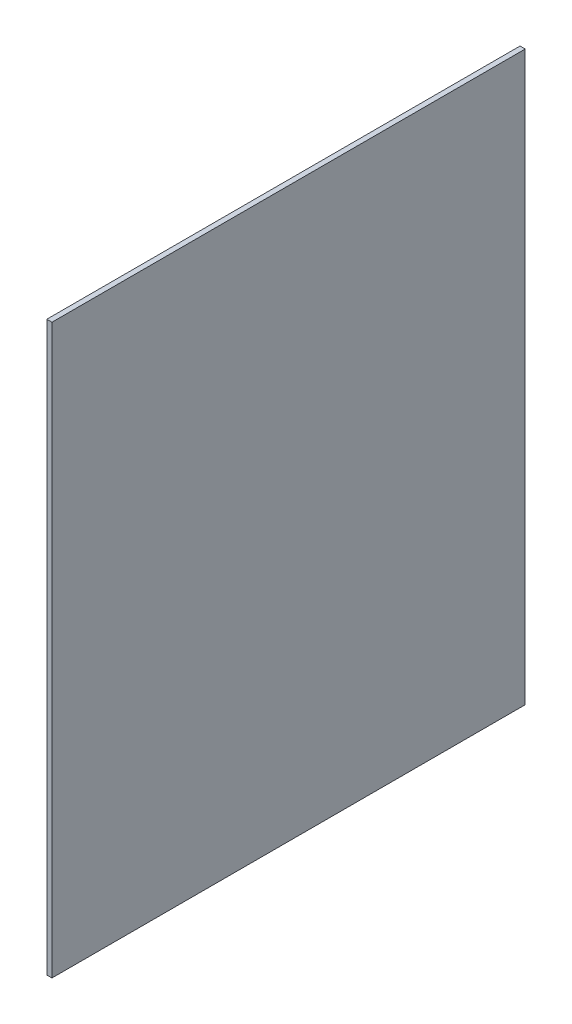
ISO-10303-21;
HEADER;
FILE_DESCRIPTION(('STEP AP214'),'2;1');
FILE_NAME('part.step','',(''),(''),'','','');
FILE_SCHEMA(('AUTOMOTIVE_DESIGN { 1 0 10303 214 1 1 1 1 }'));
ENDSEC;
DATA;
#1=APPLICATION_CONTEXT('core data for automotive mechanical design processes');
#2=APPLICATION_PROTOCOL_DEFINITION('international standard','automotive_design',2000,#1);
#3=PRODUCT_CONTEXT('',#1,'mechanical');
#4=PRODUCT('Part','Part','',(#3));
#5=PRODUCT_RELATED_PRODUCT_CATEGORY('part','',(#4));
#6=PRODUCT_DEFINITION_FORMATION('','',#4);
#7=PRODUCT_DEFINITION_CONTEXT('part definition',#1,'design');
#8=PRODUCT_DEFINITION('design','',#6,#7);
#9=PRODUCT_DEFINITION_SHAPE('','',#8);
#10=(LENGTH_UNIT() NAMED_UNIT(*) SI_UNIT(.MILLI.,.METRE.));
#11=(NAMED_UNIT(*) PLANE_ANGLE_UNIT() SI_UNIT($,.RADIAN.));
#12=(NAMED_UNIT(*) SI_UNIT($,.STERADIAN.) SOLID_ANGLE_UNIT());
#13=UNCERTAINTY_MEASURE_WITH_UNIT(LENGTH_MEASURE(1.E-05),#10,'distance_accuracy_value','');
#14=(GEOMETRIC_REPRESENTATION_CONTEXT(3) GLOBAL_UNCERTAINTY_ASSIGNED_CONTEXT((#13)) GLOBAL_UNIT_ASSIGNED_CONTEXT((#10,
#11,#12)) REPRESENTATION_CONTEXT('',''));
#15=CARTESIAN_POINT('',(0.,0.,0.));
#16=DIRECTION('',(0.,0.,1.));
#17=DIRECTION('',(1.,0.,0.));
#18=AXIS2_PLACEMENT_3D('',#15,#16,#17);
#19=CARTESIAN_POINT('',(3.,0.,0.));
#20=DIRECTION('',(0.,0.,-1.));
#21=DIRECTION('',(-1.,0.,0.));
#22=AXIS2_PLACEMENT_3D('',#19,#20,#21);
#23=PLANE('',#22);
#24=DIRECTION('',(0.,-1.,0.));
#25=VECTOR('',#24,1.);
#26=CARTESIAN_POINT('',(0.,0.,0.));
#27=LINE('',#26,#25);
#28=CARTESIAN_POINT('',(0.,330.,0.));
#29=VERTEX_POINT('',#28);
#30=CARTESIAN_POINT('',(0.,0.,0.));
#31=VERTEX_POINT('',#30);
#32=EDGE_CURVE('E107',#29,#31,#27,.T.);
#33=ORIENTED_EDGE('',*,*,#32,.T.);
#34=DIRECTION('',(-1.,0.,0.));
#35=VECTOR('',#34,1.);
#36=CARTESIAN_POINT('',(3.,0.,0.));
#37=LINE('',#36,#35);
#38=CARTESIAN_POINT('',(3.,0.,0.));
#39=VERTEX_POINT('',#38);
#40=EDGE_CURVE('E11',#39,#31,#37,.T.);
#41=ORIENTED_EDGE('',*,*,#40,.F.);
#42=DIRECTION('',(0.,-1.,0.));
#43=VECTOR('',#42,1.);
#44=CARTESIAN_POINT('',(3.,0.,0.));
#45=LINE('',#44,#43);
#46=CARTESIAN_POINT('',(3.,330.,0.));
#47=VERTEX_POINT('',#46);
#48=EDGE_CURVE('E91',#47,#39,#45,.T.);
#49=ORIENTED_EDGE('',*,*,#48,.F.);
#50=DIRECTION('',(-1.,0.,0.));
#51=VECTOR('',#50,1.);
#52=CARTESIAN_POINT('',(3.,330.,0.));
#53=LINE('',#52,#51);
#54=EDGE_CURVE('E103',#47,#29,#53,.T.);
#55=ORIENTED_EDGE('',*,*,#54,.T.);
#56=EDGE_LOOP('',(#33,#41,#49,#55));
#57=FACE_BOUND('',#56,.T.);
#58=ADVANCED_FACE('F39',(#57),#23,.F.);
#59=CARTESIAN_POINT('',(3.,0.,0.));
#60=DIRECTION('',(0.,1.,0.));
#61=DIRECTION('',(0.,0.,1.));
#62=AXIS2_PLACEMENT_3D('',#59,#60,#61);
#63=PLANE('',#62);
#64=DIRECTION('',(0.,0.,-1.));
#65=VECTOR('',#64,1.);
#66=CARTESIAN_POINT('',(0.,0.,0.));
#67=LINE('',#66,#65);
#68=CARTESIAN_POINT('',(0.,0.,-275.));
#69=VERTEX_POINT('',#68);
#70=EDGE_CURVE('E96',#31,#69,#67,.T.);
#71=ORIENTED_EDGE('',*,*,#70,.T.);
#72=DIRECTION('',(-1.,0.,0.));
#73=VECTOR('',#72,1.);
#74=CARTESIAN_POINT('',(3.,0.,-275.));
#75=LINE('',#74,#73);
#76=CARTESIAN_POINT('',(3.,0.,-275.));
#77=VERTEX_POINT('',#76);
#78=EDGE_CURVE('E48',#77,#69,#75,.T.);
#79=ORIENTED_EDGE('',*,*,#78,.F.);
#80=DIRECTION('',(0.,0.,-1.));
#81=VECTOR('',#80,1.);
#82=CARTESIAN_POINT('',(3.,0.,0.));
#83=LINE('',#82,#81);
#84=EDGE_CURVE('E86',#39,#77,#83,.T.);
#85=ORIENTED_EDGE('',*,*,#84,.F.);
#86=ORIENTED_EDGE('',*,*,#40,.T.);
#87=EDGE_LOOP('',(#71,#79,#85,#86));
#88=FACE_BOUND('',#87,.T.);
#89=ADVANCED_FACE('F95',(#88),#63,.F.);
#90=CARTESIAN_POINT('',(3.,0.,-275.));
#91=DIRECTION('',(0.,0.,1.));
#92=DIRECTION('',(1.,0.,0.));
#93=AXIS2_PLACEMENT_3D('',#90,#91,#92);
#94=PLANE('',#93);
#95=DIRECTION('',(0.,1.,0.));
#96=VECTOR('',#95,1.);
#97=CARTESIAN_POINT('',(0.,0.,-275.));
#98=LINE('',#97,#96);
#99=CARTESIAN_POINT('',(0.,330.,-275.));
#100=VERTEX_POINT('',#99);
#101=EDGE_CURVE('E73',#69,#100,#98,.T.);
#102=ORIENTED_EDGE('',*,*,#101,.T.);
#103=DIRECTION('',(-1.,0.,0.));
#104=VECTOR('',#103,1.);
#105=CARTESIAN_POINT('',(3.,330.,-275.));
#106=LINE('',#105,#104);
#107=CARTESIAN_POINT('',(3.,330.,-275.));
#108=VERTEX_POINT('',#107);
#109=EDGE_CURVE('E98',#108,#100,#106,.T.);
#110=ORIENTED_EDGE('',*,*,#109,.F.);
#111=DIRECTION('',(0.,1.,0.));
#112=VECTOR('',#111,1.);
#113=CARTESIAN_POINT('',(3.,0.,-275.));
#114=LINE('',#113,#112);
#115=EDGE_CURVE('E89',#77,#108,#114,.T.);
#116=ORIENTED_EDGE('',*,*,#115,.F.);
#117=ORIENTED_EDGE('',*,*,#78,.T.);
#118=EDGE_LOOP('',(#102,#110,#116,#117));
#119=FACE_BOUND('',#118,.T.);
#120=ADVANCED_FACE('F99',(#119),#94,.F.);
#121=CARTESIAN_POINT('',(3.,330.,0.));
#122=DIRECTION('',(0.,-1.,0.));
#123=DIRECTION('',(0.,0.,-1.));
#124=AXIS2_PLACEMENT_3D('',#121,#122,#123);
#125=PLANE('',#124);
#126=DIRECTION('',(0.,0.,1.));
#127=VECTOR('',#126,1.);
#128=CARTESIAN_POINT('',(0.,330.,0.));
#129=LINE('',#128,#127);
#130=EDGE_CURVE('E79',#100,#29,#129,.T.);
#131=ORIENTED_EDGE('',*,*,#130,.T.);
#132=ORIENTED_EDGE('',*,*,#54,.F.);
#133=DIRECTION('',(0.,0.,1.));
#134=VECTOR('',#133,1.);
#135=CARTESIAN_POINT('',(3.,330.,0.));
#136=LINE('',#135,#134);
#137=EDGE_CURVE('E56',#108,#47,#136,.T.);
#138=ORIENTED_EDGE('',*,*,#137,.F.);
#139=ORIENTED_EDGE('',*,*,#109,.T.);
#140=EDGE_LOOP('',(#131,#132,#138,#139));
#141=FACE_BOUND('',#140,.T.);
#142=ADVANCED_FACE('F120',(#141),#125,.F.);
#143=CARTESIAN_POINT('',(3.,0.,0.));
#144=DIRECTION('',(-1.,0.,0.));
#145=DIRECTION('',(0.,0.,1.));
#146=AXIS2_PLACEMENT_3D('',#143,#144,#145);
#147=PLANE('',#146);
#148=ORIENTED_EDGE('',*,*,#48,.T.);
#149=ORIENTED_EDGE('',*,*,#84,.T.);
#150=ORIENTED_EDGE('',*,*,#115,.T.);
#151=ORIENTED_EDGE('',*,*,#137,.T.);
#152=EDGE_LOOP('',(#148,#149,#150,#151));
#153=FACE_BOUND('',#152,.T.);
#154=ADVANCED_FACE('F87',(#153),#147,.F.);
#155=CARTESIAN_POINT('',(0.,0.,0.));
#156=DIRECTION('',(-1.,0.,0.));
#157=DIRECTION('',(0.,0.,1.));
#158=AXIS2_PLACEMENT_3D('',#155,#156,#157);
#159=PLANE('',#158);
#160=ORIENTED_EDGE('',*,*,#32,.F.);
#161=ORIENTED_EDGE('',*,*,#130,.F.);
#162=ORIENTED_EDGE('',*,*,#101,.F.);
#163=ORIENTED_EDGE('',*,*,#70,.F.);
#164=EDGE_LOOP('',(#160,#161,#162,#163));
#165=FACE_BOUND('',#164,.T.);
#166=ADVANCED_FACE('F123',(#165),#159,.T.);
#167=CLOSED_SHELL('',(#58,#89,#120,#142,#154,#166));
#168=MANIFOLD_SOLID_BREP('B2',#167);
#169=ADVANCED_BREP_SHAPE_REPRESENTATION('',(#18,#168),#14);
#170=SHAPE_DEFINITION_REPRESENTATION(#9,#169);
ENDSEC;
END-ISO-10303-21;
